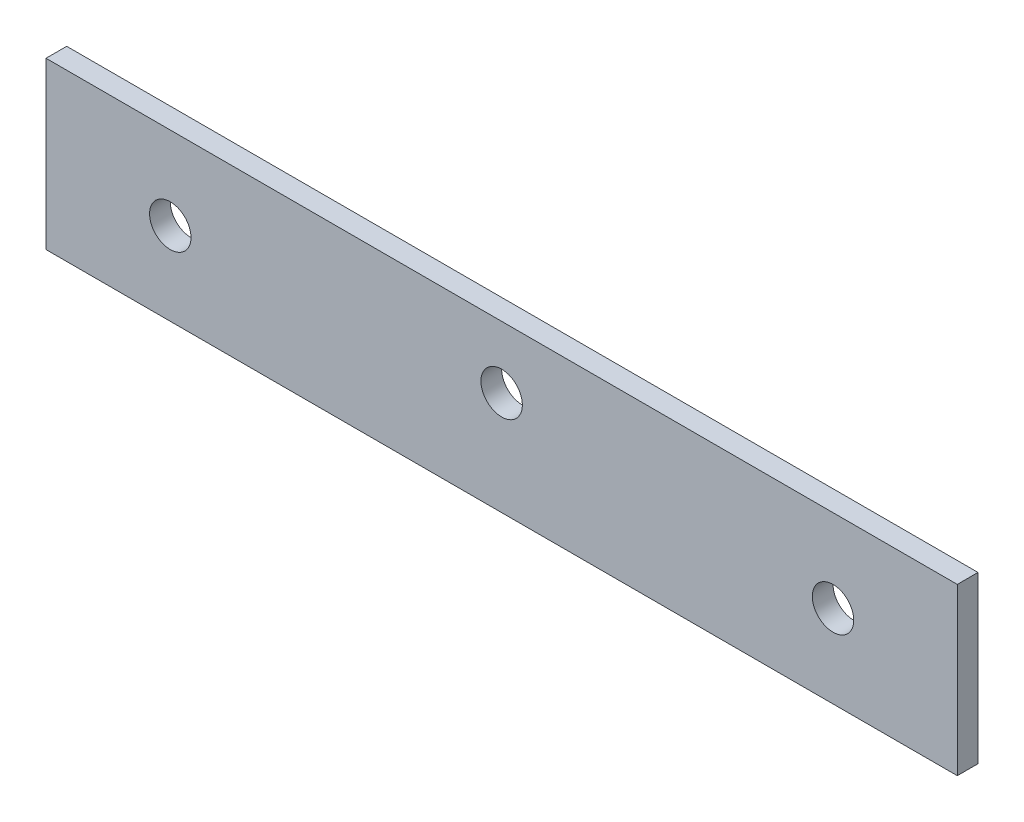
ISO-10303-21;
HEADER;
FILE_DESCRIPTION(('STEP AP214'),'2;1');
FILE_NAME('part.step','',(''),(''),'','','');
FILE_SCHEMA(('AUTOMOTIVE_DESIGN { 1 0 10303 214 1 1 1 1 }'));
ENDSEC;
DATA;
#1=APPLICATION_CONTEXT('core data for automotive mechanical design processes');
#2=APPLICATION_PROTOCOL_DEFINITION('international standard','automotive_design',2000,#1);
#3=PRODUCT_CONTEXT('',#1,'mechanical');
#4=PRODUCT('Part','Part','',(#3));
#5=PRODUCT_RELATED_PRODUCT_CATEGORY('part','',(#4));
#6=PRODUCT_DEFINITION_FORMATION('','',#4);
#7=PRODUCT_DEFINITION_CONTEXT('part definition',#1,'design');
#8=PRODUCT_DEFINITION('design','',#6,#7);
#9=PRODUCT_DEFINITION_SHAPE('','',#8);
#10=(LENGTH_UNIT() NAMED_UNIT(*) SI_UNIT(.MILLI.,.METRE.));
#11=(NAMED_UNIT(*) PLANE_ANGLE_UNIT() SI_UNIT($,.RADIAN.));
#12=(NAMED_UNIT(*) SI_UNIT($,.STERADIAN.) SOLID_ANGLE_UNIT());
#13=UNCERTAINTY_MEASURE_WITH_UNIT(LENGTH_MEASURE(1.E-05),#10,'distance_accuracy_value','');
#14=(GEOMETRIC_REPRESENTATION_CONTEXT(3) GLOBAL_UNCERTAINTY_ASSIGNED_CONTEXT((#13)) GLOBAL_UNIT_ASSIGNED_CONTEXT((#10,
#11,#12)) REPRESENTATION_CONTEXT('',''));
#15=CARTESIAN_POINT('',(0.,0.,0.));
#16=DIRECTION('',(0.,0.,1.));
#17=DIRECTION('',(1.,0.,0.));
#18=AXIS2_PLACEMENT_3D('',#15,#16,#17);
#19=CARTESIAN_POINT('',(0.,0.,5.));
#20=DIRECTION('',(0.,0.,1.));
#21=DIRECTION('',(1.,0.,0.));
#22=AXIS2_PLACEMENT_3D('',#19,#20,#21);
#23=PLANE('',#22);
#24=CARTESIAN_POINT('',(-80.,0.,5.));
#25=DIRECTION('',(0.,0.,1.));
#26=DIRECTION('',(1.,0.,0.));
#27=AXIS2_PLACEMENT_3D('',#24,#25,#26);
#28=CIRCLE('',#27,5.);
#29=CARTESIAN_POINT('',(-75.,0.,5.));
#30=VERTEX_POINT('',#29);
#31=EDGE_CURVE('E119',#30,#30,#28,.T.);
#32=ORIENTED_EDGE('',*,*,#31,.F.);
#33=EDGE_LOOP('',(#32));
#34=FACE_BOUND('',#33,.T.);
#35=DIRECTION('',(0.,1.,0.));
#36=VECTOR('',#35,1.);
#37=CARTESIAN_POINT('',(110.,20.,5.));
#38=LINE('',#37,#36);
#39=CARTESIAN_POINT('',(110.,-20.,5.));
#40=VERTEX_POINT('',#39);
#41=CARTESIAN_POINT('',(110.,20.,5.));
#42=VERTEX_POINT('',#41);
#43=EDGE_CURVE('E89',#40,#42,#38,.T.);
#44=ORIENTED_EDGE('',*,*,#43,.T.);
#45=DIRECTION('',(-1.,0.,0.));
#46=VECTOR('',#45,1.);
#47=CARTESIAN_POINT('',(-110.,20.,5.));
#48=LINE('',#47,#46);
#49=CARTESIAN_POINT('',(-110.,20.,5.));
#50=VERTEX_POINT('',#49);
#51=EDGE_CURVE('E84',#42,#50,#48,.T.);
#52=ORIENTED_EDGE('',*,*,#51,.T.);
#53=DIRECTION('',(0.,-1.,0.));
#54=VECTOR('',#53,1.);
#55=CARTESIAN_POINT('',(-110.,20.,5.));
#56=LINE('',#55,#54);
#57=CARTESIAN_POINT('',(-110.,-20.,5.));
#58=VERTEX_POINT('',#57);
#59=EDGE_CURVE('E87',#50,#58,#56,.T.);
#60=ORIENTED_EDGE('',*,*,#59,.T.);
#61=DIRECTION('',(1.,0.,0.));
#62=VECTOR('',#61,1.);
#63=CARTESIAN_POINT('',(-110.,-20.,5.));
#64=LINE('',#63,#62);
#65=EDGE_CURVE('E54',#58,#40,#64,.T.);
#66=ORIENTED_EDGE('',*,*,#65,.T.);
#67=EDGE_LOOP('',(#44,#52,#60,#66));
#68=FACE_BOUND('',#67,.T.);
#69=CARTESIAN_POINT('',(80.,0.,5.));
#70=DIRECTION('',(0.,0.,1.));
#71=DIRECTION('',(1.,0.,0.));
#72=AXIS2_PLACEMENT_3D('',#69,#70,#71);
#73=CIRCLE('',#72,5.);
#74=CARTESIAN_POINT('',(85.,0.,5.));
#75=VERTEX_POINT('',#74);
#76=EDGE_CURVE('E104',#75,#75,#73,.T.);
#77=ORIENTED_EDGE('',*,*,#76,.F.);
#78=EDGE_LOOP('',(#77));
#79=FACE_BOUND('',#78,.T.);
#80=CARTESIAN_POINT('',(0.,4.99999999999999,5.));
#81=DIRECTION('',(0.,0.,1.));
#82=DIRECTION('',(1.,0.,0.));
#83=AXIS2_PLACEMENT_3D('',#80,#81,#82);
#84=CIRCLE('',#83,5.);
#85=CARTESIAN_POINT('',(5.,4.99999999999999,5.));
#86=VERTEX_POINT('',#85);
#87=EDGE_CURVE('E125',#86,#86,#84,.T.);
#88=ORIENTED_EDGE('',*,*,#87,.F.);
#89=EDGE_LOOP('',(#88));
#90=FACE_BOUND('',#89,.T.);
#91=ADVANCED_FACE('F37',(#34,#68,#79,#90),#23,.T.);
#92=CARTESIAN_POINT('',(0.,0.,0.));
#93=DIRECTION('',(0.,0.,1.));
#94=DIRECTION('',(1.,0.,0.));
#95=AXIS2_PLACEMENT_3D('',#92,#93,#94);
#96=PLANE('',#95);
#97=DIRECTION('',(0.,1.,0.));
#98=VECTOR('',#97,1.);
#99=CARTESIAN_POINT('',(110.,20.,0.));
#100=LINE('',#99,#98);
#101=CARTESIAN_POINT('',(110.,-20.,0.));
#102=VERTEX_POINT('',#101);
#103=CARTESIAN_POINT('',(110.,20.,0.));
#104=VERTEX_POINT('',#103);
#105=EDGE_CURVE('E101',#102,#104,#100,.T.);
#106=ORIENTED_EDGE('',*,*,#105,.F.);
#107=DIRECTION('',(1.,0.,0.));
#108=VECTOR('',#107,1.);
#109=CARTESIAN_POINT('',(-110.,-20.,0.));
#110=LINE('',#109,#108);
#111=CARTESIAN_POINT('',(-110.,-20.,0.));
#112=VERTEX_POINT('',#111);
#113=EDGE_CURVE('E77',#112,#102,#110,.T.);
#114=ORIENTED_EDGE('',*,*,#113,.F.);
#115=DIRECTION('',(0.,-1.,0.));
#116=VECTOR('',#115,1.);
#117=CARTESIAN_POINT('',(-110.,20.,0.));
#118=LINE('',#117,#116);
#119=CARTESIAN_POINT('',(-110.,20.,0.));
#120=VERTEX_POINT('',#119);
#121=EDGE_CURVE('E71',#120,#112,#118,.T.);
#122=ORIENTED_EDGE('',*,*,#121,.F.);
#123=DIRECTION('',(-1.,0.,0.));
#124=VECTOR('',#123,1.);
#125=CARTESIAN_POINT('',(-110.,20.,0.));
#126=LINE('',#125,#124);
#127=EDGE_CURVE('E93',#104,#120,#126,.T.);
#128=ORIENTED_EDGE('',*,*,#127,.F.);
#129=EDGE_LOOP('',(#106,#114,#122,#128));
#130=FACE_BOUND('',#129,.T.);
#131=CARTESIAN_POINT('',(80.,0.,0.));
#132=DIRECTION('',(0.,0.,1.));
#133=DIRECTION('',(1.,0.,0.));
#134=AXIS2_PLACEMENT_3D('',#131,#132,#133);
#135=CIRCLE('',#134,5.);
#136=CARTESIAN_POINT('',(85.,0.,0.));
#137=VERTEX_POINT('',#136);
#138=EDGE_CURVE('E116',#137,#137,#135,.T.);
#139=ORIENTED_EDGE('',*,*,#138,.T.);
#140=EDGE_LOOP('',(#139));
#141=FACE_BOUND('',#140,.T.);
#142=CARTESIAN_POINT('',(-80.,0.,0.));
#143=DIRECTION('',(0.,0.,1.));
#144=DIRECTION('',(1.,0.,0.));
#145=AXIS2_PLACEMENT_3D('',#142,#143,#144);
#146=CIRCLE('',#145,5.);
#147=CARTESIAN_POINT('',(-75.,0.,0.));
#148=VERTEX_POINT('',#147);
#149=EDGE_CURVE('E122',#148,#148,#146,.T.);
#150=ORIENTED_EDGE('',*,*,#149,.T.);
#151=EDGE_LOOP('',(#150));
#152=FACE_BOUND('',#151,.T.);
#153=CARTESIAN_POINT('',(0.,4.99999999999999,0.));
#154=DIRECTION('',(0.,0.,1.));
#155=DIRECTION('',(1.,0.,0.));
#156=AXIS2_PLACEMENT_3D('',#153,#154,#155);
#157=CIRCLE('',#156,5.);
#158=CARTESIAN_POINT('',(5.,4.99999999999999,0.));
#159=VERTEX_POINT('',#158);
#160=EDGE_CURVE('E128',#159,#159,#157,.T.);
#161=ORIENTED_EDGE('',*,*,#160,.T.);
#162=EDGE_LOOP('',(#161));
#163=FACE_BOUND('',#162,.T.);
#164=ADVANCED_FACE('F112',(#130,#141,#152,#163),#96,.F.);
#165=CARTESIAN_POINT('',(110.,20.,5.));
#166=DIRECTION('',(-1.,0.,0.));
#167=DIRECTION('',(0.,0.,1.));
#168=AXIS2_PLACEMENT_3D('',#165,#166,#167);
#169=PLANE('',#168);
#170=ORIENTED_EDGE('',*,*,#105,.T.);
#171=DIRECTION('',(0.,0.,-1.));
#172=VECTOR('',#171,1.);
#173=CARTESIAN_POINT('',(110.,20.,5.));
#174=LINE('',#173,#172);
#175=EDGE_CURVE('E11',#42,#104,#174,.T.);
#176=ORIENTED_EDGE('',*,*,#175,.F.);
#177=ORIENTED_EDGE('',*,*,#43,.F.);
#178=DIRECTION('',(0.,0.,-1.));
#179=VECTOR('',#178,1.);
#180=CARTESIAN_POINT('',(110.,-20.,5.));
#181=LINE('',#180,#179);
#182=EDGE_CURVE('E97',#40,#102,#181,.T.);
#183=ORIENTED_EDGE('',*,*,#182,.T.);
#184=EDGE_LOOP('',(#170,#176,#177,#183));
#185=FACE_BOUND('',#184,.T.);
#186=ADVANCED_FACE('F39',(#185),#169,.F.);
#187=CARTESIAN_POINT('',(-110.,20.,5.));
#188=DIRECTION('',(0.,-1.,0.));
#189=DIRECTION('',(0.,0.,-1.));
#190=AXIS2_PLACEMENT_3D('',#187,#188,#189);
#191=PLANE('',#190);
#192=ORIENTED_EDGE('',*,*,#127,.T.);
#193=DIRECTION('',(0.,0.,-1.));
#194=VECTOR('',#193,1.);
#195=CARTESIAN_POINT('',(-110.,20.,5.));
#196=LINE('',#195,#194);
#197=EDGE_CURVE('E46',#50,#120,#196,.T.);
#198=ORIENTED_EDGE('',*,*,#197,.F.);
#199=ORIENTED_EDGE('',*,*,#51,.F.);
#200=ORIENTED_EDGE('',*,*,#175,.T.);
#201=EDGE_LOOP('',(#192,#198,#199,#200));
#202=FACE_BOUND('',#201,.T.);
#203=ADVANCED_FACE('F92',(#202),#191,.F.);
#204=CARTESIAN_POINT('',(-110.,20.,5.));
#205=DIRECTION('',(1.,0.,0.));
#206=DIRECTION('',(0.,0.,-1.));
#207=AXIS2_PLACEMENT_3D('',#204,#205,#206);
#208=PLANE('',#207);
#209=ORIENTED_EDGE('',*,*,#121,.T.);
#210=DIRECTION('',(0.,0.,-1.));
#211=VECTOR('',#210,1.);
#212=CARTESIAN_POINT('',(-110.,-20.,5.));
#213=LINE('',#212,#211);
#214=EDGE_CURVE('E94',#58,#112,#213,.T.);
#215=ORIENTED_EDGE('',*,*,#214,.F.);
#216=ORIENTED_EDGE('',*,*,#59,.F.);
#217=ORIENTED_EDGE('',*,*,#197,.T.);
#218=EDGE_LOOP('',(#209,#215,#216,#217));
#219=FACE_BOUND('',#218,.T.);
#220=ADVANCED_FACE('F95',(#219),#208,.F.);
#221=CARTESIAN_POINT('',(-110.,-20.,5.));
#222=DIRECTION('',(0.,1.,0.));
#223=DIRECTION('',(0.,0.,1.));
#224=AXIS2_PLACEMENT_3D('',#221,#222,#223);
#225=PLANE('',#224);
#226=ORIENTED_EDGE('',*,*,#113,.T.);
#227=ORIENTED_EDGE('',*,*,#182,.F.);
#228=ORIENTED_EDGE('',*,*,#65,.F.);
#229=ORIENTED_EDGE('',*,*,#214,.T.);
#230=EDGE_LOOP('',(#226,#227,#228,#229));
#231=FACE_BOUND('',#230,.T.);
#232=ADVANCED_FACE('F109',(#231),#225,.F.);
#233=CARTESIAN_POINT('',(80.,0.,5.));
#234=DIRECTION('',(0.,0.,-1.));
#235=DIRECTION('',(-1.,0.,0.));
#236=AXIS2_PLACEMENT_3D('',#233,#234,#235);
#237=CYLINDRICAL_SURFACE('',#236,5.);
#238=ORIENTED_EDGE('',*,*,#76,.T.);
#239=EDGE_LOOP('',(#238));
#240=FACE_BOUND('',#239,.T.);
#241=ORIENTED_EDGE('',*,*,#138,.F.);
#242=EDGE_LOOP('',(#241));
#243=FACE_BOUND('',#242,.T.);
#244=ADVANCED_FACE('F146',(#240,#243),#237,.F.);
#245=CARTESIAN_POINT('',(-80.,0.,5.));
#246=DIRECTION('',(0.,0.,-1.));
#247=DIRECTION('',(-1.,0.,0.));
#248=AXIS2_PLACEMENT_3D('',#245,#246,#247);
#249=CYLINDRICAL_SURFACE('',#248,5.);
#250=ORIENTED_EDGE('',*,*,#31,.T.);
#251=EDGE_LOOP('',(#250));
#252=FACE_BOUND('',#251,.T.);
#253=ORIENTED_EDGE('',*,*,#149,.F.);
#254=EDGE_LOOP('',(#253));
#255=FACE_BOUND('',#254,.T.);
#256=ADVANCED_FACE('F192',(#252,#255),#249,.F.);
#257=CARTESIAN_POINT('',(0.,4.99999999999999,5.));
#258=DIRECTION('',(0.,0.,-1.));
#259=DIRECTION('',(-1.,0.,0.));
#260=AXIS2_PLACEMENT_3D('',#257,#258,#259);
#261=CYLINDRICAL_SURFACE('',#260,5.);
#262=ORIENTED_EDGE('',*,*,#87,.T.);
#263=EDGE_LOOP('',(#262));
#264=FACE_BOUND('',#263,.T.);
#265=ORIENTED_EDGE('',*,*,#160,.F.);
#266=EDGE_LOOP('',(#265));
#267=FACE_BOUND('',#266,.T.);
#268=ADVANCED_FACE('F134',(#264,#267),#261,.F.);
#269=CLOSED_SHELL('',(#91,#164,#186,#203,#220,#232,#244,#256,#268));
#270=MANIFOLD_SOLID_BREP('B2',#269);
#271=ADVANCED_BREP_SHAPE_REPRESENTATION('',(#18,#270),#14);
#272=SHAPE_DEFINITION_REPRESENTATION(#9,#271);
ENDSEC;
END-ISO-10303-21;
